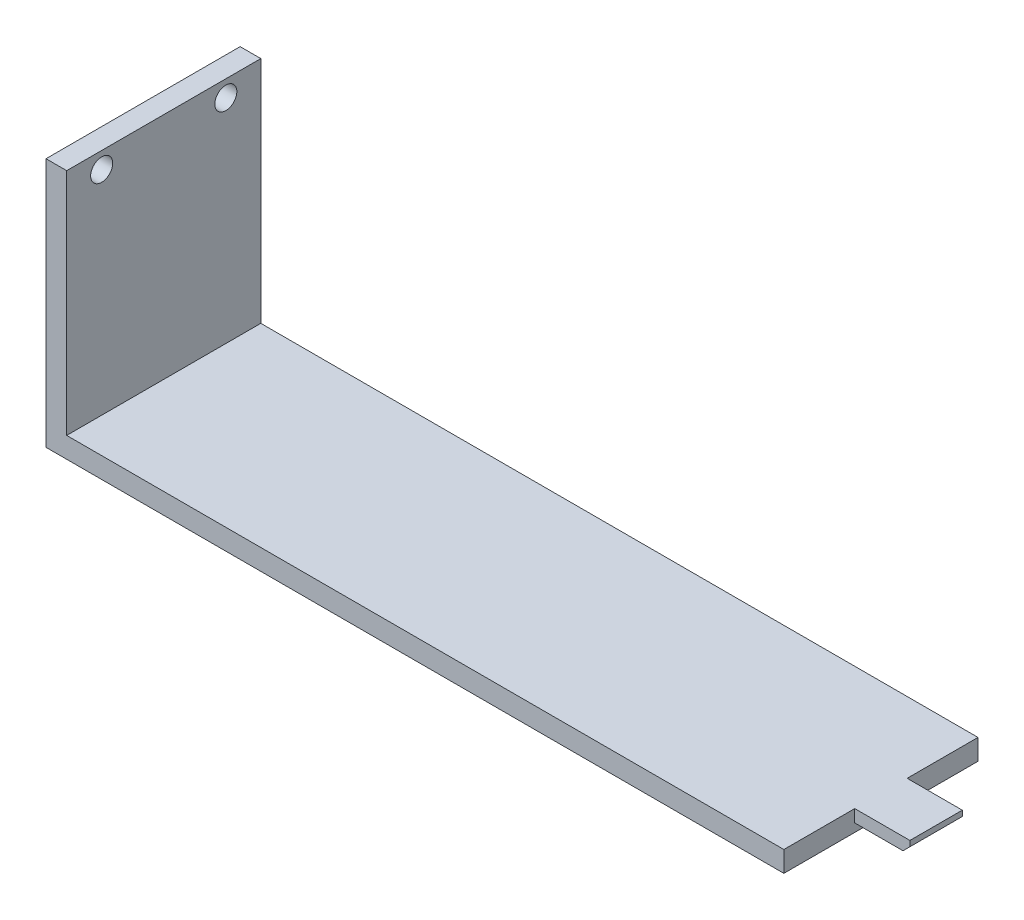
ISO-10303-21;
HEADER;
FILE_DESCRIPTION(('STEP AP214'),'2;1');
FILE_NAME('part.step','',(''),(''),'','','');
FILE_SCHEMA(('AUTOMOTIVE_DESIGN { 1 0 10303 214 1 1 1 1 }'));
ENDSEC;
DATA;
#1=APPLICATION_CONTEXT('core data for automotive mechanical design processes');
#2=APPLICATION_PROTOCOL_DEFINITION('international standard','automotive_design',2000,#1);
#3=PRODUCT_CONTEXT('',#1,'mechanical');
#4=PRODUCT('Part','Part','',(#3));
#5=PRODUCT_RELATED_PRODUCT_CATEGORY('part','',(#4));
#6=PRODUCT_DEFINITION_FORMATION('','',#4);
#7=PRODUCT_DEFINITION_CONTEXT('part definition',#1,'design');
#8=PRODUCT_DEFINITION('design','',#6,#7);
#9=PRODUCT_DEFINITION_SHAPE('','',#8);
#10=(LENGTH_UNIT() NAMED_UNIT(*) SI_UNIT(.MILLI.,.METRE.));
#11=(NAMED_UNIT(*) PLANE_ANGLE_UNIT() SI_UNIT($,.RADIAN.));
#12=(NAMED_UNIT(*) SI_UNIT($,.STERADIAN.) SOLID_ANGLE_UNIT());
#13=UNCERTAINTY_MEASURE_WITH_UNIT(LENGTH_MEASURE(1.E-05),#10,'distance_accuracy_value','');
#14=(GEOMETRIC_REPRESENTATION_CONTEXT(3) GLOBAL_UNCERTAINTY_ASSIGNED_CONTEXT((#13)) GLOBAL_UNIT_ASSIGNED_CONTEXT((#10,
#11,#12)) REPRESENTATION_CONTEXT('',''));
#15=CARTESIAN_POINT('',(0.,0.,0.));
#16=DIRECTION('',(0.,0.,1.));
#17=DIRECTION('',(1.,0.,0.));
#18=AXIS2_PLACEMENT_3D('',#15,#16,#17);
#19=CARTESIAN_POINT('',(57.389337641357,3.,-11.3222940226171));
#20=DIRECTION('',(-1.,0.,0.));
#21=DIRECTION('',(0.,0.,1.));
#22=AXIS2_PLACEMENT_3D('',#19,#20,#21);
#23=PLANE('',#22);
#24=DIRECTION('',(0.,-1.,0.));
#25=VECTOR('',#24,1.);
#26=CARTESIAN_POINT('',(57.389337641357,3.,6.55270597738288));
#27=LINE('',#26,#25);
#28=CARTESIAN_POINT('',(57.389337641357,3.,6.55270597738288));
#29=VERTEX_POINT('',#28);
#30=CARTESIAN_POINT('',(57.389337641357,1.2,6.55270597738288));
#31=VERTEX_POINT('',#30);
#32=EDGE_CURVE('E179',#29,#31,#27,.T.);
#33=ORIENTED_EDGE('',*,*,#32,.F.);
#34=DIRECTION('',(0.,0.,-1.));
#35=VECTOR('',#34,1.);
#36=CARTESIAN_POINT('',(57.389337641357,3.,-11.3222940226171));
#37=LINE('',#36,#35);
#38=CARTESIAN_POINT('',(57.389337641357,3.,16.8277059773829));
#39=VERTEX_POINT('',#38);
#40=EDGE_CURVE('E220',#39,#29,#37,.T.);
#41=ORIENTED_EDGE('',*,*,#40,.F.);
#42=DIRECTION('',(0.,-1.,0.));
#43=VECTOR('',#42,1.);
#44=CARTESIAN_POINT('',(57.389337641357,3.,16.8277059773829));
#45=LINE('',#44,#43);
#46=CARTESIAN_POINT('',(57.389337641357,0.,16.8277059773829));
#47=VERTEX_POINT('',#46);
#48=EDGE_CURVE('E145',#39,#47,#45,.T.);
#49=ORIENTED_EDGE('',*,*,#48,.T.);
#50=DIRECTION('',(0.,0.,-1.));
#51=VECTOR('',#50,1.);
#52=CARTESIAN_POINT('',(57.389337641357,0.,-11.3222940226171));
#53=LINE('',#52,#51);
#54=CARTESIAN_POINT('',(57.389337641357,0.,-11.3222940226171));
#55=VERTEX_POINT('',#54);
#56=EDGE_CURVE('E233',#47,#55,#53,.T.);
#57=ORIENTED_EDGE('',*,*,#56,.T.);
#58=DIRECTION('',(0.,-1.,0.));
#59=VECTOR('',#58,1.);
#60=CARTESIAN_POINT('',(57.389337641357,3.,-11.3222940226171));
#61=LINE('',#60,#59);
#62=CARTESIAN_POINT('',(57.389337641357,3.,-11.3222940226171));
#63=VERTEX_POINT('',#62);
#64=EDGE_CURVE('E240',#63,#55,#61,.T.);
#65=ORIENTED_EDGE('',*,*,#64,.F.);
#66=CARTESIAN_POINT('',(57.389337641357,3.,-1.04729402261712));
#67=VERTEX_POINT('',#66);
#68=EDGE_CURVE('E218',#67,#63,#37,.T.);
#69=ORIENTED_EDGE('',*,*,#68,.F.);
#70=DIRECTION('',(0.,1.,0.));
#71=VECTOR('',#70,1.);
#72=CARTESIAN_POINT('',(57.389337641357,3.,-1.04729402261712));
#73=LINE('',#72,#71);
#74=CARTESIAN_POINT('',(57.389337641357,1.2,-1.04729402261712));
#75=VERTEX_POINT('',#74);
#76=EDGE_CURVE('E185',#75,#67,#73,.T.);
#77=ORIENTED_EDGE('',*,*,#76,.F.);
#78=DIRECTION('',(0.,0.,-1.));
#79=VECTOR('',#78,1.);
#80=CARTESIAN_POINT('',(57.389337641357,1.2,6.55270597738288));
#81=LINE('',#80,#79);
#82=EDGE_CURVE('E195',#31,#75,#81,.T.);
#83=ORIENTED_EDGE('',*,*,#82,.F.);
#84=EDGE_LOOP('',(#33,#41,#49,#57,#65,#69,#77,#83));
#85=FACE_BOUND('',#84,.T.);
#86=ADVANCED_FACE('F47',(#85),#23,.F.);
#87=CARTESIAN_POINT('',(-49.610662358643,3.,-11.3222940226171));
#88=DIRECTION('',(1.,0.,0.));
#89=DIRECTION('',(0.,0.,-1.));
#90=AXIS2_PLACEMENT_3D('',#87,#88,#89);
#91=PLANE('',#90);
#92=CARTESIAN_POINT('',(-49.610662358643,33.85,-6.24729402261712));
#93=DIRECTION('',(-1.,0.,0.));
#94=DIRECTION('',(0.,0.,1.));
#95=AXIS2_PLACEMENT_3D('',#92,#93,#94);
#96=CIRCLE('',#95,1.6);
#97=CARTESIAN_POINT('',(-49.610662358643,33.85,-4.64729402261712));
#98=VERTEX_POINT('',#97);
#99=EDGE_CURVE('E257',#98,#98,#96,.T.);
#100=ORIENTED_EDGE('',*,*,#99,.F.);
#101=EDGE_LOOP('',(#100));
#102=FACE_BOUND('',#101,.T.);
#103=CARTESIAN_POINT('',(-49.610662358643,33.85,11.7527059773829));
#104=DIRECTION('',(-1.,0.,0.));
#105=DIRECTION('',(0.,0.,1.));
#106=AXIS2_PLACEMENT_3D('',#103,#104,#105);
#107=CIRCLE('',#106,1.6);
#108=CARTESIAN_POINT('',(-49.610662358643,33.85,13.3527059773829));
#109=VERTEX_POINT('',#108);
#110=EDGE_CURVE('E166',#109,#109,#107,.T.);
#111=ORIENTED_EDGE('',*,*,#110,.F.);
#112=EDGE_LOOP('',(#111));
#113=FACE_BOUND('',#112,.T.);
#114=DIRECTION('',(0.,0.,1.));
#115=VECTOR('',#114,1.);
#116=CARTESIAN_POINT('',(-49.610662358643,0.,-11.3222940226171));
#117=LINE('',#116,#115);
#118=CARTESIAN_POINT('',(-49.610662358643,0.,-11.3222940226171));
#119=VERTEX_POINT('',#118);
#120=CARTESIAN_POINT('',(-49.610662358643,0.,16.8277059773829));
#121=VERTEX_POINT('',#120);
#122=EDGE_CURVE('E141',#119,#121,#117,.T.);
#123=ORIENTED_EDGE('',*,*,#122,.T.);
#124=DIRECTION('',(0.,-1.,0.));
#125=VECTOR('',#124,1.);
#126=CARTESIAN_POINT('',(-49.610662358643,3.,16.8277059773829));
#127=LINE('',#126,#125);
#128=CARTESIAN_POINT('',(-49.610662358643,36.25,16.8277059773829));
#129=VERTEX_POINT('',#128);
#130=EDGE_CURVE('E134',#129,#121,#127,.T.);
#131=ORIENTED_EDGE('',*,*,#130,.F.);
#132=DIRECTION('',(0.,0.,1.));
#133=VECTOR('',#132,1.);
#134=CARTESIAN_POINT('',(-49.610662358643,36.25,-11.3222940226171));
#135=LINE('',#134,#133);
#136=CARTESIAN_POINT('',(-49.610662358643,36.25,-11.3222940226171));
#137=VERTEX_POINT('',#136);
#138=EDGE_CURVE('E139',#137,#129,#135,.T.);
#139=ORIENTED_EDGE('',*,*,#138,.F.);
#140=DIRECTION('',(0.,-1.,0.));
#141=VECTOR('',#140,1.);
#142=CARTESIAN_POINT('',(-49.610662358643,3.,-11.3222940226171));
#143=LINE('',#142,#141);
#144=EDGE_CURVE('E227',#137,#119,#143,.T.);
#145=ORIENTED_EDGE('',*,*,#144,.T.);
#146=EDGE_LOOP('',(#123,#131,#139,#145));
#147=FACE_BOUND('',#146,.T.);
#148=ADVANCED_FACE('F136',(#102,#113,#147),#91,.F.);
#149=CARTESIAN_POINT('',(-49.610662358643,3.,16.8277059773829));
#150=DIRECTION('',(0.,0.,-1.));
#151=DIRECTION('',(-1.,0.,0.));
#152=AXIS2_PLACEMENT_3D('',#149,#150,#151);
#153=PLANE('',#152);
#154=DIRECTION('',(1.,0.,0.));
#155=VECTOR('',#154,1.);
#156=CARTESIAN_POINT('',(-49.610662358643,0.,16.8277059773829));
#157=LINE('',#156,#155);
#158=EDGE_CURVE('E230',#121,#47,#157,.T.);
#159=ORIENTED_EDGE('',*,*,#158,.T.);
#160=ORIENTED_EDGE('',*,*,#48,.F.);
#161=DIRECTION('',(1.,0.,0.));
#162=VECTOR('',#161,1.);
#163=CARTESIAN_POINT('',(-49.610662358643,3.,16.8277059773829));
#164=LINE('',#163,#162);
#165=CARTESIAN_POINT('',(-46.610662358643,3.,16.8277059773829));
#166=VERTEX_POINT('',#165);
#167=EDGE_CURVE('E215',#166,#39,#164,.T.);
#168=ORIENTED_EDGE('',*,*,#167,.F.);
#169=DIRECTION('',(0.,-1.,0.));
#170=VECTOR('',#169,1.);
#171=CARTESIAN_POINT('',(-46.610662358643,36.25,16.8277059773829));
#172=LINE('',#171,#170);
#173=CARTESIAN_POINT('',(-46.610662358643,36.25,16.8277059773829));
#174=VERTEX_POINT('',#173);
#175=EDGE_CURVE('E151',#174,#166,#172,.T.);
#176=ORIENTED_EDGE('',*,*,#175,.F.);
#177=DIRECTION('',(1.,0.,0.));
#178=VECTOR('',#177,1.);
#179=CARTESIAN_POINT('',(-49.610662358643,36.25,16.8277059773829));
#180=LINE('',#179,#178);
#181=EDGE_CURVE('E148',#129,#174,#180,.T.);
#182=ORIENTED_EDGE('',*,*,#181,.F.);
#183=ORIENTED_EDGE('',*,*,#130,.T.);
#184=EDGE_LOOP('',(#159,#160,#168,#176,#182,#183));
#185=FACE_BOUND('',#184,.T.);
#186=ADVANCED_FACE('F149',(#185),#153,.F.);
#187=CARTESIAN_POINT('',(-49.610662358643,3.,-11.3222940226171));
#188=DIRECTION('',(0.,0.,1.));
#189=DIRECTION('',(1.,0.,0.));
#190=AXIS2_PLACEMENT_3D('',#187,#188,#189);
#191=PLANE('',#190);
#192=DIRECTION('',(-1.,0.,0.));
#193=VECTOR('',#192,1.);
#194=CARTESIAN_POINT('',(-49.610662358643,0.,-11.3222940226171));
#195=LINE('',#194,#193);
#196=EDGE_CURVE('E219',#55,#119,#195,.T.);
#197=ORIENTED_EDGE('',*,*,#196,.T.);
#198=ORIENTED_EDGE('',*,*,#144,.F.);
#199=DIRECTION('',(-1.,0.,0.));
#200=VECTOR('',#199,1.);
#201=CARTESIAN_POINT('',(-49.610662358643,36.25,-11.3222940226171));
#202=LINE('',#201,#200);
#203=CARTESIAN_POINT('',(-46.610662358643,36.25,-11.3222940226171));
#204=VERTEX_POINT('',#203);
#205=EDGE_CURVE('E160',#204,#137,#202,.T.);
#206=ORIENTED_EDGE('',*,*,#205,.F.);
#207=DIRECTION('',(0.,-1.,0.));
#208=VECTOR('',#207,1.);
#209=CARTESIAN_POINT('',(-46.610662358643,36.25,-11.3222940226171));
#210=LINE('',#209,#208);
#211=CARTESIAN_POINT('',(-46.610662358643,3.,-11.3222940226171));
#212=VERTEX_POINT('',#211);
#213=EDGE_CURVE('E172',#204,#212,#210,.T.);
#214=ORIENTED_EDGE('',*,*,#213,.T.);
#215=DIRECTION('',(-1.,0.,0.));
#216=VECTOR('',#215,1.);
#217=CARTESIAN_POINT('',(-49.610662358643,3.,-11.3222940226171));
#218=LINE('',#217,#216);
#219=EDGE_CURVE('E224',#63,#212,#218,.T.);
#220=ORIENTED_EDGE('',*,*,#219,.F.);
#221=ORIENTED_EDGE('',*,*,#64,.T.);
#222=EDGE_LOOP('',(#197,#198,#206,#214,#220,#221));
#223=FACE_BOUND('',#222,.T.);
#224=ADVANCED_FACE('F280',(#223),#191,.F.);
#225=CARTESIAN_POINT('',(0.,3.,0.));
#226=DIRECTION('',(0.,1.,0.));
#227=DIRECTION('',(0.,0.,1.));
#228=AXIS2_PLACEMENT_3D('',#225,#226,#227);
#229=PLANE('',#228);
#230=DIRECTION('',(0.,0.,-1.));
#231=VECTOR('',#230,1.);
#232=CARTESIAN_POINT('',(-46.610662358643,3.,-11.3222940226171));
#233=LINE('',#232,#231);
#234=EDGE_CURVE('E66',#166,#212,#233,.T.);
#235=ORIENTED_EDGE('',*,*,#234,.F.);
#236=ORIENTED_EDGE('',*,*,#167,.T.);
#237=ORIENTED_EDGE('',*,*,#40,.T.);
#238=DIRECTION('',(-1.,0.,0.));
#239=VECTOR('',#238,1.);
#240=CARTESIAN_POINT('',(65.389337641357,3.,6.55270597738288));
#241=LINE('',#240,#239);
#242=CARTESIAN_POINT('',(65.389337641357,3.,6.55270597738288));
#243=VERTEX_POINT('',#242);
#244=EDGE_CURVE('E191',#243,#29,#241,.T.);
#245=ORIENTED_EDGE('',*,*,#244,.F.);
#246=DIRECTION('',(0.,0.,1.));
#247=VECTOR('',#246,1.);
#248=CARTESIAN_POINT('',(65.389337641357,3.,6.55270597738288));
#249=LINE('',#248,#247);
#250=CARTESIAN_POINT('',(65.389337641357,3.,-1.04729402261712));
#251=VERTEX_POINT('',#250);
#252=EDGE_CURVE('E188',#251,#243,#249,.T.);
#253=ORIENTED_EDGE('',*,*,#252,.F.);
#254=DIRECTION('',(-1.,0.,0.));
#255=VECTOR('',#254,1.);
#256=CARTESIAN_POINT('',(65.389337641357,3.,-1.04729402261712));
#257=LINE('',#256,#255);
#258=EDGE_CURVE('E205',#251,#67,#257,.T.);
#259=ORIENTED_EDGE('',*,*,#258,.T.);
#260=ORIENTED_EDGE('',*,*,#68,.T.);
#261=ORIENTED_EDGE('',*,*,#219,.T.);
#262=EDGE_LOOP('',(#235,#236,#237,#245,#253,#259,#260,#261));
#263=FACE_BOUND('',#262,.T.);
#264=ADVANCED_FACE('F288',(#263),#229,.T.);
#265=CARTESIAN_POINT('',(0.,0.,0.));
#266=DIRECTION('',(0.,1.,0.));
#267=DIRECTION('',(0.,0.,1.));
#268=AXIS2_PLACEMENT_3D('',#265,#266,#267);
#269=PLANE('',#268);
#270=ORIENTED_EDGE('',*,*,#122,.F.);
#271=ORIENTED_EDGE('',*,*,#196,.F.);
#272=ORIENTED_EDGE('',*,*,#56,.F.);
#273=ORIENTED_EDGE('',*,*,#158,.F.);
#274=EDGE_LOOP('',(#270,#271,#272,#273));
#275=FACE_BOUND('',#274,.T.);
#276=ADVANCED_FACE('F290',(#275),#269,.F.);
#277=CARTESIAN_POINT('',(65.389337641357,3.,6.55270597738288));
#278=DIRECTION('',(0.,0.,-1.));
#279=DIRECTION('',(-1.,0.,0.));
#280=AXIS2_PLACEMENT_3D('',#277,#278,#279);
#281=PLANE('',#280);
#282=DIRECTION('',(-1.,0.,0.));
#283=VECTOR('',#282,1.);
#284=CARTESIAN_POINT('',(65.389337641357,1.2,6.55270597738288));
#285=LINE('',#284,#283);
#286=CARTESIAN_POINT('',(64.389337641357,1.2,6.55270597738288));
#287=VERTEX_POINT('',#286);
#288=EDGE_CURVE('E212',#287,#31,#285,.T.);
#289=ORIENTED_EDGE('',*,*,#288,.F.);
#290=DIRECTION('',(0.707106781186548,0.707106781186548,0.));
#291=VECTOR('',#290,1.);
#292=CARTESIAN_POINT('',(65.389337641357,2.2,6.55270597738288));
#293=LINE('',#292,#291);
#294=CARTESIAN_POINT('',(65.389337641357,2.2,6.55270597738288));
#295=VERTEX_POINT('',#294);
#296=EDGE_CURVE('E11',#287,#295,#293,.T.);
#297=ORIENTED_EDGE('',*,*,#296,.T.);
#298=DIRECTION('',(0.,-1.,0.));
#299=VECTOR('',#298,1.);
#300=CARTESIAN_POINT('',(65.389337641357,3.,6.55270597738288));
#301=LINE('',#300,#299);
#302=EDGE_CURVE('E180',#243,#295,#301,.T.);
#303=ORIENTED_EDGE('',*,*,#302,.F.);
#304=ORIENTED_EDGE('',*,*,#244,.T.);
#305=ORIENTED_EDGE('',*,*,#32,.T.);
#306=EDGE_LOOP('',(#289,#297,#303,#304,#305));
#307=FACE_BOUND('',#306,.T.);
#308=ADVANCED_FACE('F293',(#307),#281,.F.);
#309=CARTESIAN_POINT('',(65.389337641357,1.2,6.55270597738288));
#310=DIRECTION('',(0.,1.,0.));
#311=DIRECTION('',(0.,0.,1.));
#312=AXIS2_PLACEMENT_3D('',#309,#310,#311);
#313=PLANE('',#312);
#314=DIRECTION('',(-1.,0.,0.));
#315=VECTOR('',#314,1.);
#316=CARTESIAN_POINT('',(65.389337641357,1.2,-1.04729402261712));
#317=LINE('',#316,#315);
#318=CARTESIAN_POINT('',(64.389337641357,1.2,-1.04729402261712));
#319=VERTEX_POINT('',#318);
#320=EDGE_CURVE('E209',#319,#75,#317,.T.);
#321=ORIENTED_EDGE('',*,*,#320,.F.);
#322=DIRECTION('',(0.,0.,1.));
#323=VECTOR('',#322,1.);
#324=CARTESIAN_POINT('',(64.389337641357,1.2,6.55270597738288));
#325=LINE('',#324,#323);
#326=EDGE_CURVE('E58',#319,#287,#325,.T.);
#327=ORIENTED_EDGE('',*,*,#326,.T.);
#328=ORIENTED_EDGE('',*,*,#288,.T.);
#329=ORIENTED_EDGE('',*,*,#82,.T.);
#330=EDGE_LOOP('',(#321,#327,#328,#329));
#331=FACE_BOUND('',#330,.T.);
#332=ADVANCED_FACE('F299',(#331),#313,.F.);
#333=CARTESIAN_POINT('',(65.389337641357,3.,-1.04729402261712));
#334=DIRECTION('',(0.,0.,1.));
#335=DIRECTION('',(0.,-1.,0.));
#336=AXIS2_PLACEMENT_3D('',#333,#334,#335);
#337=PLANE('',#336);
#338=DIRECTION('',(0.,1.,0.));
#339=VECTOR('',#338,1.);
#340=CARTESIAN_POINT('',(65.389337641357,3.,-1.04729402261712));
#341=LINE('',#340,#339);
#342=CARTESIAN_POINT('',(65.389337641357,2.2,-1.04729402261712));
#343=VERTEX_POINT('',#342);
#344=EDGE_CURVE('E184',#343,#251,#341,.T.);
#345=ORIENTED_EDGE('',*,*,#344,.F.);
#346=DIRECTION('',(-0.707106781186548,-0.707106781186548,0.));
#347=VECTOR('',#346,1.);
#348=CARTESIAN_POINT('',(65.389337641357,2.2,-1.04729402261712));
#349=LINE('',#348,#347);
#350=EDGE_CURVE('E250',#343,#319,#349,.T.);
#351=ORIENTED_EDGE('',*,*,#350,.T.);
#352=ORIENTED_EDGE('',*,*,#320,.T.);
#353=ORIENTED_EDGE('',*,*,#76,.T.);
#354=ORIENTED_EDGE('',*,*,#258,.F.);
#355=EDGE_LOOP('',(#345,#351,#352,#353,#354));
#356=FACE_BOUND('',#355,.T.);
#357=ADVANCED_FACE('F303',(#356),#337,.F.);
#358=CARTESIAN_POINT('',(65.389337641357,0.,0.));
#359=DIRECTION('',(1.,0.,0.));
#360=DIRECTION('',(0.,0.,-1.));
#361=AXIS2_PLACEMENT_3D('',#358,#359,#360);
#362=PLANE('',#361);
#363=ORIENTED_EDGE('',*,*,#302,.T.);
#364=DIRECTION('',(0.,0.,-1.));
#365=VECTOR('',#364,1.);
#366=CARTESIAN_POINT('',(65.389337641357,2.2,-1.04729402261712));
#367=LINE('',#366,#365);
#368=EDGE_CURVE('E144',#295,#343,#367,.T.);
#369=ORIENTED_EDGE('',*,*,#368,.T.);
#370=ORIENTED_EDGE('',*,*,#344,.T.);
#371=ORIENTED_EDGE('',*,*,#252,.T.);
#372=EDGE_LOOP('',(#363,#369,#370,#371));
#373=FACE_BOUND('',#372,.T.);
#374=ADVANCED_FACE('F306',(#373),#362,.T.);
#375=CARTESIAN_POINT('',(65.389337641357,2.2,0.));
#376=DIRECTION('',(0.707106781186547,-0.707106781186547,0.));
#377=DIRECTION('',(0.,0.,1.));
#378=AXIS2_PLACEMENT_3D('',#375,#376,#377);
#379=PLANE('',#378);
#380=ORIENTED_EDGE('',*,*,#296,.F.);
#381=ORIENTED_EDGE('',*,*,#326,.F.);
#382=ORIENTED_EDGE('',*,*,#350,.F.);
#383=ORIENTED_EDGE('',*,*,#368,.F.);
#384=EDGE_LOOP('',(#380,#381,#382,#383));
#385=FACE_BOUND('',#384,.T.);
#386=ADVANCED_FACE('F50',(#385),#379,.T.);
#387=CARTESIAN_POINT('',(-46.610662358643,36.25,-11.3222940226171));
#388=DIRECTION('',(-1.,0.,0.));
#389=DIRECTION('',(0.,0.,1.));
#390=AXIS2_PLACEMENT_3D('',#387,#388,#389);
#391=PLANE('',#390);
#392=CARTESIAN_POINT('',(-46.610662358643,33.85,-6.24729402261712));
#393=DIRECTION('',(-1.,0.,0.));
#394=DIRECTION('',(0.,0.,1.));
#395=AXIS2_PLACEMENT_3D('',#392,#393,#394);
#396=CIRCLE('',#395,1.6);
#397=CARTESIAN_POINT('',(-46.610662358643,33.85,-4.64729402261712));
#398=VERTEX_POINT('',#397);
#399=EDGE_CURVE('E52',#398,#398,#396,.T.);
#400=ORIENTED_EDGE('',*,*,#399,.T.);
#401=EDGE_LOOP('',(#400));
#402=FACE_BOUND('',#401,.T.);
#403=CARTESIAN_POINT('',(-46.610662358643,33.85,11.7527059773829));
#404=DIRECTION('',(-1.,0.,0.));
#405=DIRECTION('',(0.,0.,1.));
#406=AXIS2_PLACEMENT_3D('',#403,#404,#405);
#407=CIRCLE('',#406,1.6);
#408=CARTESIAN_POINT('',(-46.610662358643,33.85,13.3527059773829));
#409=VERTEX_POINT('',#408);
#410=EDGE_CURVE('E254',#409,#409,#407,.T.);
#411=ORIENTED_EDGE('',*,*,#410,.T.);
#412=EDGE_LOOP('',(#411));
#413=FACE_BOUND('',#412,.T.);
#414=ORIENTED_EDGE('',*,*,#234,.T.);
#415=ORIENTED_EDGE('',*,*,#213,.F.);
#416=DIRECTION('',(0.,0.,-1.));
#417=VECTOR('',#416,1.);
#418=CARTESIAN_POINT('',(-46.610662358643,36.25,-11.3222940226171));
#419=LINE('',#418,#417);
#420=EDGE_CURVE('E155',#174,#204,#419,.T.);
#421=ORIENTED_EDGE('',*,*,#420,.F.);
#422=ORIENTED_EDGE('',*,*,#175,.T.);
#423=EDGE_LOOP('',(#414,#415,#421,#422));
#424=FACE_BOUND('',#423,.T.);
#425=ADVANCED_FACE('F311',(#402,#413,#424),#391,.F.);
#426=CARTESIAN_POINT('',(0.,36.25,0.));
#427=DIRECTION('',(0.,1.,0.));
#428=DIRECTION('',(0.,0.,1.));
#429=AXIS2_PLACEMENT_3D('',#426,#427,#428);
#430=PLANE('',#429);
#431=ORIENTED_EDGE('',*,*,#138,.T.);
#432=ORIENTED_EDGE('',*,*,#181,.T.);
#433=ORIENTED_EDGE('',*,*,#420,.T.);
#434=ORIENTED_EDGE('',*,*,#205,.T.);
#435=EDGE_LOOP('',(#431,#432,#433,#434));
#436=FACE_BOUND('',#435,.T.);
#437=ADVANCED_FACE('F158',(#436),#430,.T.);
#438=CARTESIAN_POINT('',(-16.360662358643,33.85,11.7527059773829));
#439=DIRECTION('',(-1.,0.,0.));
#440=DIRECTION('',(0.,0.,1.));
#441=AXIS2_PLACEMENT_3D('',#438,#439,#440);
#442=CYLINDRICAL_SURFACE('',#441,1.6);
#443=ORIENTED_EDGE('',*,*,#110,.T.);
#444=EDGE_LOOP('',(#443));
#445=FACE_BOUND('',#444,.T.);
#446=ORIENTED_EDGE('',*,*,#410,.F.);
#447=EDGE_LOOP('',(#446));
#448=FACE_BOUND('',#447,.T.);
#449=ADVANCED_FACE('F270',(#445,#448),#442,.F.);
#450=CARTESIAN_POINT('',(-16.360662358643,33.85,-6.24729402261712));
#451=DIRECTION('',(-1.,0.,0.));
#452=DIRECTION('',(0.,0.,1.));
#453=AXIS2_PLACEMENT_3D('',#450,#451,#452);
#454=CYLINDRICAL_SURFACE('',#453,1.6);
#455=ORIENTED_EDGE('',*,*,#99,.T.);
#456=EDGE_LOOP('',(#455));
#457=FACE_BOUND('',#456,.T.);
#458=ORIENTED_EDGE('',*,*,#399,.F.);
#459=EDGE_LOOP('',(#458));
#460=FACE_BOUND('',#459,.T.);
#461=ADVANCED_FACE('F317',(#457,#460),#454,.F.);
#462=CLOSED_SHELL('',(#86,#148,#186,#224,#264,#276,#308,#332,#357,#374,#386,#425,#437,#449,#461));
#463=MANIFOLD_SOLID_BREP('B2',#462);
#464=ADVANCED_BREP_SHAPE_REPRESENTATION('',(#18,#463),#14);
#465=SHAPE_DEFINITION_REPRESENTATION(#9,#464);
ENDSEC;
END-ISO-10303-21;
